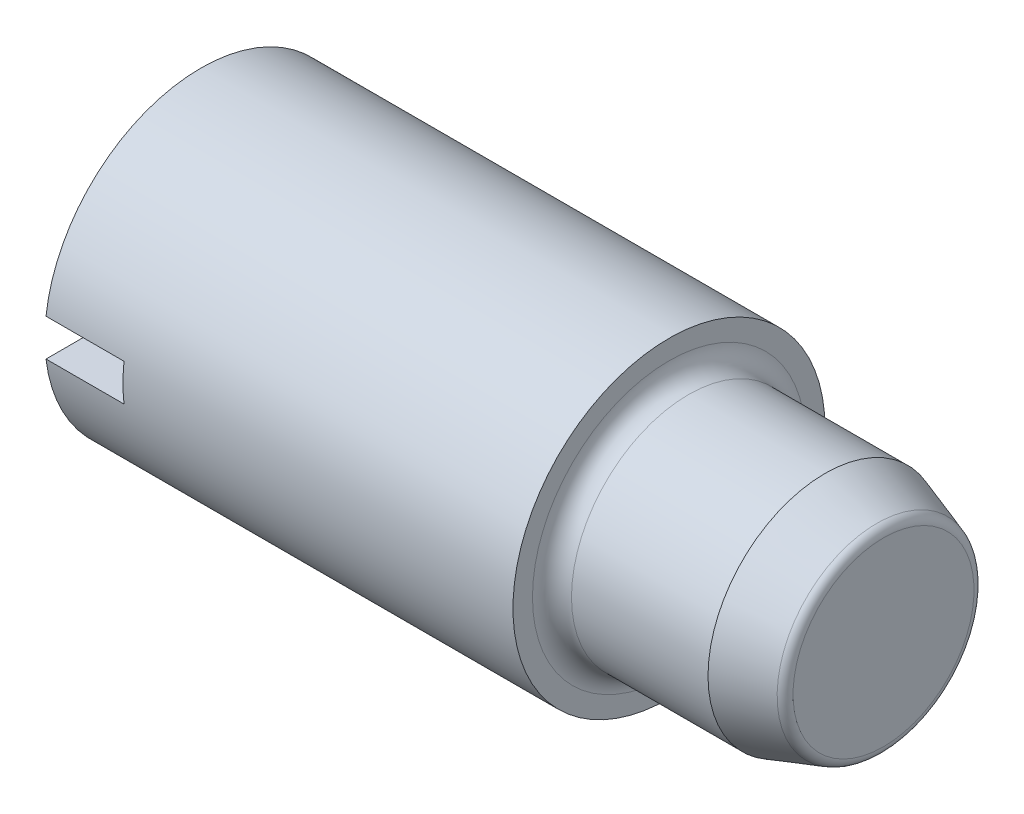
ISO-10303-21;
HEADER;
FILE_DESCRIPTION(('STEP AP214'),'2;1');
FILE_NAME('part.step','',(''),(''),'','','');
FILE_SCHEMA(('AUTOMOTIVE_DESIGN { 1 0 10303 214 1 1 1 1 }'));
ENDSEC;
DATA;
#1=APPLICATION_CONTEXT('core data for automotive mechanical design processes');
#2=APPLICATION_PROTOCOL_DEFINITION('international standard','automotive_design',2000,#1);
#3=PRODUCT_CONTEXT('',#1,'mechanical');
#4=PRODUCT('Part','Part','',(#3));
#5=PRODUCT_RELATED_PRODUCT_CATEGORY('part','',(#4));
#6=PRODUCT_DEFINITION_FORMATION('','',#4);
#7=PRODUCT_DEFINITION_CONTEXT('part definition',#1,'design');
#8=PRODUCT_DEFINITION('design','',#6,#7);
#9=PRODUCT_DEFINITION_SHAPE('','',#8);
#10=(LENGTH_UNIT() NAMED_UNIT(*) SI_UNIT(.MILLI.,.METRE.));
#11=(NAMED_UNIT(*) PLANE_ANGLE_UNIT() SI_UNIT($,.RADIAN.));
#12=(NAMED_UNIT(*) SI_UNIT($,.STERADIAN.) SOLID_ANGLE_UNIT());
#13=UNCERTAINTY_MEASURE_WITH_UNIT(LENGTH_MEASURE(1.E-05),#10,'distance_accuracy_value','');
#14=(GEOMETRIC_REPRESENTATION_CONTEXT(3) GLOBAL_UNCERTAINTY_ASSIGNED_CONTEXT((#13)) GLOBAL_UNIT_ASSIGNED_CONTEXT((#10,
#11,#12)) REPRESENTATION_CONTEXT('',''));
#15=CARTESIAN_POINT('',(0.,0.,0.));
#16=DIRECTION('',(0.,0.,1.));
#17=DIRECTION('',(1.,0.,0.));
#18=AXIS2_PLACEMENT_3D('',#15,#16,#17);
#19=CARTESIAN_POINT('',(29.7338498500428,3.,0.));
#20=DIRECTION('',(1.,0.,0.));
#21=DIRECTION('',(0.,0.,-1.));
#22=AXIS2_PLACEMENT_3D('',#19,#20,#21);
#23=PLANE('',#22);
#24=CARTESIAN_POINT('',(29.7338498500428,0.,0.));
#25=DIRECTION('',(-1.,0.,0.));
#26=DIRECTION('',(0.,1.,0.));
#27=AXIS2_PLACEMENT_3D('',#24,#25,#26);
#28=CIRCLE('',#27,4.63962038997194);
#29=CARTESIAN_POINT('',(29.7338498500428,4.63962038997194,0.));
#30=VERTEX_POINT('',#29);
#31=EDGE_CURVE('E89',#30,#30,#28,.T.);
#32=ORIENTED_EDGE('',*,*,#31,.F.);
#33=EDGE_LOOP('',(#32));
#34=FACE_BOUND('',#33,.T.);
#35=ADVANCED_FACE('F17',(#34),#23,.T.);
#36=CARTESIAN_POINT('',(29.2338498500428,0.,0.));
#37=DIRECTION('',(-1.,0.,0.));
#38=DIRECTION('',(0.,0.,1.));
#39=AXIS2_PLACEMENT_3D('',#36,#37,#38);
#40=TOROIDAL_SURFACE('',#39,4.63962038997194,0.5);
#41=CARTESIAN_POINT('',(29.3919637330191,0.,0.));
#42=DIRECTION('',(-1.,0.,0.));
#43=DIRECTION('',(0.,-1.,0.));
#44=AXIS2_PLACEMENT_3D('',#41,#42,#43);
#45=CIRCLE('',#44,5.11396203904724);
#46=CARTESIAN_POINT('',(29.3919637330191,-5.11396203904724,0.));
#47=VERTEX_POINT('',#46);
#48=EDGE_CURVE('E115',#47,#47,#45,.T.);
#49=ORIENTED_EDGE('',*,*,#48,.F.);
#50=EDGE_LOOP('',(#49));
#51=FACE_BOUND('',#50,.T.);
#52=ORIENTED_EDGE('',*,*,#31,.T.);
#53=EDGE_LOOP('',(#52));
#54=FACE_BOUND('',#53,.T.);
#55=ADVANCED_FACE('F94',(#51,#54),#40,.T.);
#56=CARTESIAN_POINT('',(26.733849850018,0.,0.));
#57=DIRECTION('',(-1.,0.,0.));
#58=DIRECTION('',(0.,0.,1.));
#59=AXIS2_PLACEMENT_3D('',#56,#57,#58);
#60=CONICAL_SURFACE('',#59,6.00000000005707,0.32175055439985);
#61=ORIENTED_EDGE('',*,*,#48,.T.);
#62=EDGE_LOOP('',(#61));
#63=FACE_BOUND('',#62,.T.);
#64=CARTESIAN_POINT('',(26.7338498500428,0.,0.));
#65=DIRECTION('',(1.,0.,0.));
#66=DIRECTION('',(0.,0.,-1.));
#67=AXIS2_PLACEMENT_3D('',#64,#65,#66);
#68=CIRCLE('',#67,6.);
#69=CARTESIAN_POINT('',(26.7338498500428,0.,-6.));
#70=VERTEX_POINT('',#69);
#71=EDGE_CURVE('E118',#70,#70,#68,.F.);
#72=ORIENTED_EDGE('',*,*,#71,.F.);
#73=EDGE_LOOP('',(#72));
#74=FACE_BOUND('',#73,.T.);
#75=ADVANCED_FACE('F105',(#63,#74),#60,.T.);
#76=CARTESIAN_POINT('',(24.2338498500428,0.,0.));
#77=DIRECTION('',(1.,0.,0.));
#78=DIRECTION('',(0.,0.,-1.));
#79=AXIS2_PLACEMENT_3D('',#76,#77,#78);
#80=CYLINDRICAL_SURFACE('',#79,6.);
#81=CARTESIAN_POINT('',(19.7338498500429,0.,0.));
#82=DIRECTION('',(1.,0.,0.));
#83=DIRECTION('',(0.,0.,-1.));
#84=AXIS2_PLACEMENT_3D('',#81,#82,#83);
#85=CIRCLE('',#84,6.);
#86=CARTESIAN_POINT('',(19.7338498500429,0.,-6.));
#87=VERTEX_POINT('',#86);
#88=EDGE_CURVE('E121',#87,#87,#85,.F.);
#89=ORIENTED_EDGE('',*,*,#88,.F.);
#90=EDGE_LOOP('',(#89));
#91=FACE_BOUND('',#90,.T.);
#92=ORIENTED_EDGE('',*,*,#71,.T.);
#93=EDGE_LOOP('',(#92));
#94=FACE_BOUND('',#93,.T.);
#95=ADVANCED_FACE('F130',(#91,#94),#80,.T.);
#96=CARTESIAN_POINT('',(19.7338498500429,0.,0.));
#97=DIRECTION('',(1.,0.,0.));
#98=DIRECTION('',(0.,0.,-1.));
#99=AXIS2_PLACEMENT_3D('',#96,#97,#98);
#100=TOROIDAL_SURFACE('',#99,7.,1.);
#101=ORIENTED_EDGE('',*,*,#88,.T.);
#102=EDGE_LOOP('',(#101));
#103=FACE_BOUND('',#102,.T.);
#104=CARTESIAN_POINT('',(18.7338498500428,0.,0.));
#105=DIRECTION('',(1.,0.,0.));
#106=DIRECTION('',(0.,1.,0.));
#107=AXIS2_PLACEMENT_3D('',#104,#105,#106);
#108=CIRCLE('',#107,7.);
#109=CARTESIAN_POINT('',(18.7338498500428,7.,0.));
#110=VERTEX_POINT('',#109);
#111=EDGE_CURVE('E76',#110,#110,#108,.F.);
#112=ORIENTED_EDGE('',*,*,#111,.F.);
#113=EDGE_LOOP('',(#112));
#114=FACE_BOUND('',#113,.T.);
#115=ADVANCED_FACE('F125',(#103,#114),#100,.F.);
#116=CARTESIAN_POINT('',(-5.26615014995715,4.,0.));
#117=DIRECTION('',(-1.,0.,0.));
#118=DIRECTION('',(0.,0.,1.));
#119=AXIS2_PLACEMENT_3D('',#116,#117,#118);
#120=PLANE('',#119);
#121=CARTESIAN_POINT('',(-5.26615014995715,0.,0.));
#122=DIRECTION('',(1.,0.,0.));
#123=DIRECTION('',(0.,0.,-1.));
#124=AXIS2_PLACEMENT_3D('',#121,#122,#123);
#125=CIRCLE('',#124,8.);
#126=CARTESIAN_POINT('',(-5.26615014995715,0.949999999999998,-7.9433934813781));
#127=VERTEX_POINT('',#126);
#128=CARTESIAN_POINT('',(-5.26615014995715,0.949999999999998,7.9433934813781));
#129=VERTEX_POINT('',#128);
#130=EDGE_CURVE('E148',#127,#129,#125,.T.);
#131=ORIENTED_EDGE('',*,*,#130,.F.);
#132=DIRECTION('',(0.,0.,1.));
#133=VECTOR('',#132,1.);
#134=CARTESIAN_POINT('',(-5.26615014995715,0.949999999999998,9.));
#135=LINE('',#134,#133);
#136=EDGE_CURVE('E68',#127,#129,#135,.T.);
#137=ORIENTED_EDGE('',*,*,#136,.T.);
#138=EDGE_LOOP('',(#131,#137));
#139=FACE_BOUND('',#138,.T.);
#140=ADVANCED_FACE('F129',(#139),#120,.T.);
#141=CARTESIAN_POINT('',(-5.26615014995715,0.949999999999998,9.));
#142=DIRECTION('',(0.,1.,0.));
#143=DIRECTION('',(0.,0.,1.));
#144=AXIS2_PLACEMENT_3D('',#141,#142,#143);
#145=PLANE('',#144);
#146=ORIENTED_EDGE('',*,*,#136,.F.);
#147=DIRECTION('',(1.,0.,0.));
#148=VECTOR('',#147,1.);
#149=CARTESIAN_POINT('',(6.73384985004285,0.949999999999998,-7.9433934813781));
#150=LINE('',#149,#148);
#151=CARTESIAN_POINT('',(-1.26615014995715,0.949999999999998,-7.9433934813781));
#152=VERTEX_POINT('',#151);
#153=EDGE_CURVE('E72',#152,#127,#150,.F.);
#154=ORIENTED_EDGE('',*,*,#153,.F.);
#155=DIRECTION('',(0.,0.,-1.));
#156=VECTOR('',#155,1.);
#157=CARTESIAN_POINT('',(-1.26615014995715,0.949999999999998,0.));
#158=LINE('',#157,#156);
#159=CARTESIAN_POINT('',(-1.26615014995715,0.949999999999998,7.9433934813781));
#160=VERTEX_POINT('',#159);
#161=EDGE_CURVE('E57',#152,#160,#158,.F.);
#162=ORIENTED_EDGE('',*,*,#161,.T.);
#163=DIRECTION('',(1.,0.,0.));
#164=VECTOR('',#163,1.);
#165=CARTESIAN_POINT('',(6.73384985004285,0.949999999999997,7.9433934813781));
#166=LINE('',#165,#164);
#167=EDGE_CURVE('E146',#129,#160,#166,.T.);
#168=ORIENTED_EDGE('',*,*,#167,.F.);
#169=EDGE_LOOP('',(#146,#154,#162,#168));
#170=FACE_BOUND('',#169,.T.);
#171=ADVANCED_FACE('F73',(#170),#145,.F.);
#172=CARTESIAN_POINT('',(-1.26615014995715,0.,0.));
#173=DIRECTION('',(1.,0.,0.));
#174=DIRECTION('',(0.,0.,-1.));
#175=AXIS2_PLACEMENT_3D('',#172,#173,#174);
#176=PLANE('',#175);
#177=ORIENTED_EDGE('',*,*,#161,.F.);
#178=CARTESIAN_POINT('',(-1.26615014995715,0.,0.));
#179=DIRECTION('',(1.,0.,0.));
#180=DIRECTION('',(0.,0.,-1.));
#181=AXIS2_PLACEMENT_3D('',#178,#179,#180);
#182=CIRCLE('',#181,8.);
#183=CARTESIAN_POINT('',(-1.26615014995715,-0.950000000000003,-7.9433934813781));
#184=VERTEX_POINT('',#183);
#185=EDGE_CURVE('E21',#184,#152,#182,.T.);
#186=ORIENTED_EDGE('',*,*,#185,.F.);
#187=DIRECTION('',(0.,0.,-1.));
#188=VECTOR('',#187,1.);
#189=CARTESIAN_POINT('',(-1.26615014995715,-0.950000000000002,-9.));
#190=LINE('',#189,#188);
#191=CARTESIAN_POINT('',(-1.26615014995715,-0.949999999999999,7.9433934813781));
#192=VERTEX_POINT('',#191);
#193=EDGE_CURVE('E67',#184,#192,#190,.F.);
#194=ORIENTED_EDGE('',*,*,#193,.T.);
#195=CARTESIAN_POINT('',(-1.26615014995715,0.,0.));
#196=DIRECTION('',(1.,0.,0.));
#197=DIRECTION('',(0.,0.,-1.));
#198=AXIS2_PLACEMENT_3D('',#195,#196,#197);
#199=CIRCLE('',#198,8.);
#200=EDGE_CURVE('E63',#160,#192,#199,.T.);
#201=ORIENTED_EDGE('',*,*,#200,.F.);
#202=EDGE_LOOP('',(#177,#186,#194,#201));
#203=FACE_BOUND('',#202,.T.);
#204=ADVANCED_FACE('F59',(#203),#176,.F.);
#205=CARTESIAN_POINT('',(-5.26615014995715,-0.950000000000002,-9.));
#206=DIRECTION('',(0.,-1.,0.));
#207=DIRECTION('',(0.,0.,-1.));
#208=AXIS2_PLACEMENT_3D('',#205,#206,#207);
#209=PLANE('',#208);
#210=ORIENTED_EDGE('',*,*,#193,.F.);
#211=DIRECTION('',(1.,0.,0.));
#212=VECTOR('',#211,1.);
#213=CARTESIAN_POINT('',(6.73384985004285,-0.950000000000004,-7.9433934813781));
#214=LINE('',#213,#212);
#215=CARTESIAN_POINT('',(-5.26615014995715,-0.950000000000002,-7.9433934813781));
#216=VERTEX_POINT('',#215);
#217=EDGE_CURVE('E80',#216,#184,#214,.T.);
#218=ORIENTED_EDGE('',*,*,#217,.F.);
#219=DIRECTION('',(0.,0.,1.));
#220=VECTOR('',#219,1.);
#221=CARTESIAN_POINT('',(-5.26615014995715,-0.95,0.));
#222=LINE('',#221,#220);
#223=CARTESIAN_POINT('',(-5.26615014995715,-0.95,7.9433934813781));
#224=VERTEX_POINT('',#223);
#225=EDGE_CURVE('E36',#224,#216,#222,.F.);
#226=ORIENTED_EDGE('',*,*,#225,.F.);
#227=DIRECTION('',(1.,0.,0.));
#228=VECTOR('',#227,1.);
#229=CARTESIAN_POINT('',(6.73384985004285,-0.949999999999997,7.9433934813781));
#230=LINE('',#229,#228);
#231=EDGE_CURVE('E150',#192,#224,#230,.F.);
#232=ORIENTED_EDGE('',*,*,#231,.F.);
#233=EDGE_LOOP('',(#210,#218,#226,#232));
#234=FACE_BOUND('',#233,.T.);
#235=ADVANCED_FACE('F169',(#234),#209,.F.);
#236=CARTESIAN_POINT('',(-5.26615014995715,4.,0.));
#237=DIRECTION('',(-1.,0.,0.));
#238=DIRECTION('',(0.,0.,1.));
#239=AXIS2_PLACEMENT_3D('',#236,#237,#238);
#240=PLANE('',#239);
#241=ORIENTED_EDGE('',*,*,#225,.T.);
#242=CARTESIAN_POINT('',(-5.26615014995715,0.,0.));
#243=DIRECTION('',(1.,0.,0.));
#244=DIRECTION('',(0.,0.,-1.));
#245=AXIS2_PLACEMENT_3D('',#242,#243,#244);
#246=CIRCLE('',#245,8.);
#247=EDGE_CURVE('E27',#224,#216,#246,.T.);
#248=ORIENTED_EDGE('',*,*,#247,.F.);
#249=EDGE_LOOP('',(#241,#248));
#250=FACE_BOUND('',#249,.T.);
#251=ADVANCED_FACE('F165',(#250),#240,.T.);
#252=CARTESIAN_POINT('',(18.7338498500428,7.,0.));
#253=DIRECTION('',(1.,0.,0.));
#254=DIRECTION('',(0.,0.,-1.));
#255=AXIS2_PLACEMENT_3D('',#252,#253,#254);
#256=PLANE('',#255);
#257=ORIENTED_EDGE('',*,*,#111,.T.);
#258=EDGE_LOOP('',(#257));
#259=FACE_BOUND('',#258,.T.);
#260=CARTESIAN_POINT('',(18.7338498500428,0.,0.));
#261=DIRECTION('',(1.,0.,0.));
#262=DIRECTION('',(0.,0.,-1.));
#263=AXIS2_PLACEMENT_3D('',#260,#261,#262);
#264=CIRCLE('',#263,8.);
#265=CARTESIAN_POINT('',(18.7338498500428,0.,-8.));
#266=VERTEX_POINT('',#265);
#267=EDGE_CURVE('E11',#266,#266,#264,.F.);
#268=ORIENTED_EDGE('',*,*,#267,.F.);
#269=EDGE_LOOP('',(#268));
#270=FACE_BOUND('',#269,.T.);
#271=ADVANCED_FACE('F156',(#259,#270),#256,.T.);
#272=CARTESIAN_POINT('',(6.73384985004285,0.,0.));
#273=DIRECTION('',(1.,0.,0.));
#274=DIRECTION('',(0.,0.,-1.));
#275=AXIS2_PLACEMENT_3D('',#272,#273,#274);
#276=CYLINDRICAL_SURFACE('',#275,8.);
#277=ORIENTED_EDGE('',*,*,#153,.T.);
#278=ORIENTED_EDGE('',*,*,#130,.T.);
#279=ORIENTED_EDGE('',*,*,#167,.T.);
#280=ORIENTED_EDGE('',*,*,#200,.T.);
#281=ORIENTED_EDGE('',*,*,#231,.T.);
#282=ORIENTED_EDGE('',*,*,#247,.T.);
#283=ORIENTED_EDGE('',*,*,#217,.T.);
#284=ORIENTED_EDGE('',*,*,#185,.T.);
#285=EDGE_LOOP('',(#277,#278,#279,#280,#281,#282,#283,#284));
#286=FACE_BOUND('',#285,.T.);
#287=ORIENTED_EDGE('',*,*,#267,.T.);
#288=EDGE_LOOP('',(#287));
#289=FACE_BOUND('',#288,.T.);
#290=ADVANCED_FACE('F19',(#286,#289),#276,.T.);
#291=CLOSED_SHELL('',(#35,#55,#75,#95,#115,#140,#171,#204,#235,#251,#271,#290));
#292=MANIFOLD_SOLID_BREP('B1',#291);
#293=ADVANCED_BREP_SHAPE_REPRESENTATION('',(#18,#292),#14);
#294=SHAPE_DEFINITION_REPRESENTATION(#9,#293);
ENDSEC;
END-ISO-10303-21;
